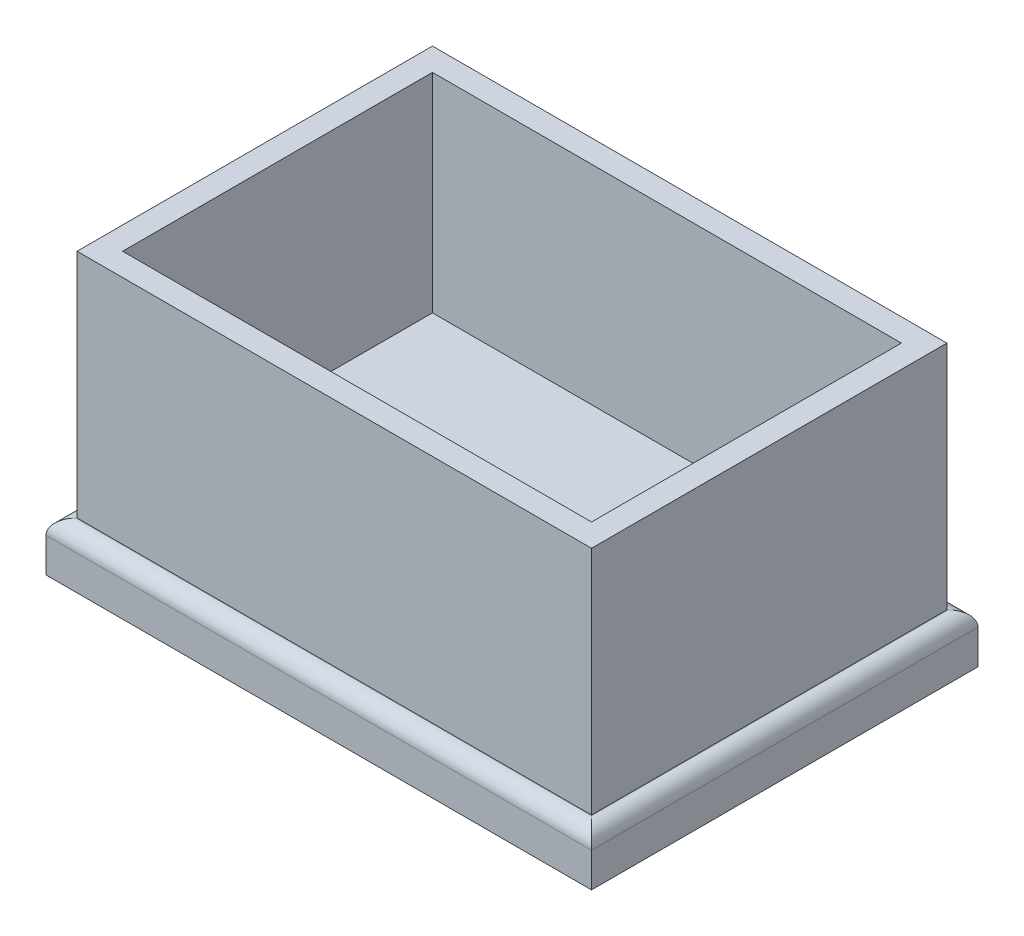
ISO-10303-21;
HEADER;
FILE_DESCRIPTION(('STEP AP214'),'2;1');
FILE_NAME('part.step','',(''),(''),'','','');
FILE_SCHEMA(('AUTOMOTIVE_DESIGN { 1 0 10303 214 1 1 1 1 }'));
ENDSEC;
DATA;
#1=APPLICATION_CONTEXT('core data for automotive mechanical design processes');
#2=APPLICATION_PROTOCOL_DEFINITION('international standard','automotive_design',2000,#1);
#3=PRODUCT_CONTEXT('',#1,'mechanical');
#4=PRODUCT('Part','Part','',(#3));
#5=PRODUCT_RELATED_PRODUCT_CATEGORY('part','',(#4));
#6=PRODUCT_DEFINITION_FORMATION('','',#4);
#7=PRODUCT_DEFINITION_CONTEXT('part definition',#1,'design');
#8=PRODUCT_DEFINITION('design','',#6,#7);
#9=PRODUCT_DEFINITION_SHAPE('','',#8);
#10=(LENGTH_UNIT() NAMED_UNIT(*) SI_UNIT(.MILLI.,.METRE.));
#11=(NAMED_UNIT(*) PLANE_ANGLE_UNIT() SI_UNIT($,.RADIAN.));
#12=(NAMED_UNIT(*) SI_UNIT($,.STERADIAN.) SOLID_ANGLE_UNIT());
#13=UNCERTAINTY_MEASURE_WITH_UNIT(LENGTH_MEASURE(1.E-05),#10,'distance_accuracy_value','');
#14=(GEOMETRIC_REPRESENTATION_CONTEXT(3) GLOBAL_UNCERTAINTY_ASSIGNED_CONTEXT((#13)) GLOBAL_UNIT_ASSIGNED_CONTEXT((#10,
#11,#12)) REPRESENTATION_CONTEXT('',''));
#15=CARTESIAN_POINT('',(0.,0.,0.));
#16=DIRECTION('',(0.,0.,1.));
#17=DIRECTION('',(1.,0.,0.));
#18=AXIS2_PLACEMENT_3D('',#15,#16,#17);
#19=CARTESIAN_POINT('',(0.,70.8406,0.));
#20=DIRECTION('',(0.,1.,0.));
#21=DIRECTION('',(0.,0.,1.));
#22=AXIS2_PLACEMENT_3D('',#19,#20,#21);
#23=PLANE('',#22);
#24=DIRECTION('',(1.,0.,0.));
#25=VECTOR('',#24,1.);
#26=CARTESIAN_POINT('',(-78.867,70.8406,47.498));
#27=LINE('',#26,#25);
#28=CARTESIAN_POINT('',(-71.882,70.8406,47.498));
#29=VERTEX_POINT('',#28);
#30=CARTESIAN_POINT('',(71.882,70.8406,47.498));
#31=VERTEX_POINT('',#30);
#32=EDGE_CURVE('E191',#29,#31,#27,.T.);
#33=ORIENTED_EDGE('',*,*,#32,.F.);
#34=DIRECTION('',(0.,0.,1.));
#35=VECTOR('',#34,1.);
#36=CARTESIAN_POINT('',(-71.882,70.8406,54.483));
#37=LINE('',#36,#35);
#38=CARTESIAN_POINT('',(-71.882,70.8406,-47.498));
#39=VERTEX_POINT('',#38);
#40=EDGE_CURVE('E189',#39,#29,#37,.T.);
#41=ORIENTED_EDGE('',*,*,#40,.F.);
#42=DIRECTION('',(-1.,0.,0.));
#43=VECTOR('',#42,1.);
#44=CARTESIAN_POINT('',(-78.867,70.8406,-47.498));
#45=LINE('',#44,#43);
#46=CARTESIAN_POINT('',(71.882,70.8406,-47.498));
#47=VERTEX_POINT('',#46);
#48=EDGE_CURVE('E56',#47,#39,#45,.T.);
#49=ORIENTED_EDGE('',*,*,#48,.F.);
#50=DIRECTION('',(0.,0.,-1.));
#51=VECTOR('',#50,1.);
#52=CARTESIAN_POINT('',(71.882,70.8406,54.483));
#53=LINE('',#52,#51);
#54=EDGE_CURVE('E176',#31,#47,#53,.T.);
#55=ORIENTED_EDGE('',*,*,#54,.F.);
#56=EDGE_LOOP('',(#33,#41,#49,#55));
#57=FACE_BOUND('',#56,.T.);
#58=DIRECTION('',(1.,0.,0.));
#59=VECTOR('',#58,1.);
#60=CARTESIAN_POINT('',(-78.867,70.8406,54.483));
#61=LINE('',#60,#59);
#62=CARTESIAN_POINT('',(-78.867,70.8406,54.483));
#63=VERTEX_POINT('',#62);
#64=CARTESIAN_POINT('',(78.867,70.8406,54.483));
#65=VERTEX_POINT('',#64);
#66=EDGE_CURVE('E213',#63,#65,#61,.T.);
#67=ORIENTED_EDGE('',*,*,#66,.T.);
#68=DIRECTION('',(0.,0.,-1.));
#69=VECTOR('',#68,1.);
#70=CARTESIAN_POINT('',(78.867,70.8406,54.483));
#71=LINE('',#70,#69);
#72=CARTESIAN_POINT('',(78.867,70.8406,-54.483));
#73=VERTEX_POINT('',#72);
#74=EDGE_CURVE('E287',#65,#73,#71,.T.);
#75=ORIENTED_EDGE('',*,*,#74,.T.);
#76=DIRECTION('',(-1.,0.,0.));
#77=VECTOR('',#76,1.);
#78=CARTESIAN_POINT('',(-78.867,70.8406,-54.483));
#79=LINE('',#78,#77);
#80=CARTESIAN_POINT('',(-78.867,70.8406,-54.483));
#81=VERTEX_POINT('',#80);
#82=EDGE_CURVE('E285',#73,#81,#79,.T.);
#83=ORIENTED_EDGE('',*,*,#82,.T.);
#84=DIRECTION('',(0.,0.,1.));
#85=VECTOR('',#84,1.);
#86=CARTESIAN_POINT('',(-78.867,70.8406,54.483));
#87=LINE('',#86,#85);
#88=EDGE_CURVE('E280',#81,#63,#87,.T.);
#89=ORIENTED_EDGE('',*,*,#88,.T.);
#90=EDGE_LOOP('',(#67,#75,#83,#89));
#91=FACE_BOUND('',#90,.T.);
#92=ADVANCED_FACE('F39',(#57,#91),#23,.T.);
#93=CARTESIAN_POINT('',(78.867,114.1349,54.483));
#94=DIRECTION('',(-1.,0.,0.));
#95=DIRECTION('',(0.,0.,1.));
#96=AXIS2_PLACEMENT_3D('',#93,#94,#95);
#97=PLANE('',#96);
#98=ORIENTED_EDGE('',*,*,#74,.F.);
#99=DIRECTION('',(0.,-1.,0.));
#100=VECTOR('',#99,1.);
#101=CARTESIAN_POINT('',(78.867,114.1349,54.483));
#102=LINE('',#101,#100);
#103=CARTESIAN_POINT('',(78.867,0.,54.483));
#104=VERTEX_POINT('',#103);
#105=EDGE_CURVE('E216',#65,#104,#102,.T.);
#106=ORIENTED_EDGE('',*,*,#105,.T.);
#107=DIRECTION('',(0.,0.,-1.));
#108=VECTOR('',#107,1.);
#109=CARTESIAN_POINT('',(78.867,0.,54.483));
#110=LINE('',#109,#108);
#111=CARTESIAN_POINT('',(78.8669999999999,0.,-54.483));
#112=VERTEX_POINT('',#111);
#113=EDGE_CURVE('E233',#104,#112,#110,.T.);
#114=ORIENTED_EDGE('',*,*,#113,.T.);
#115=DIRECTION('',(0.,-1.,0.));
#116=VECTOR('',#115,1.);
#117=CARTESIAN_POINT('',(78.867,114.1349,-54.483));
#118=LINE('',#117,#116);
#119=EDGE_CURVE('E292',#73,#112,#118,.T.);
#120=ORIENTED_EDGE('',*,*,#119,.F.);
#121=EDGE_LOOP('',(#98,#106,#114,#120));
#122=FACE_BOUND('',#121,.T.);
#123=ADVANCED_FACE('F261',(#122),#97,.F.);
#124=CARTESIAN_POINT('',(-78.867,114.1349,-54.483));
#125=DIRECTION('',(0.,0.,1.));
#126=DIRECTION('',(1.,0.,0.));
#127=AXIS2_PLACEMENT_3D('',#124,#125,#126);
#128=PLANE('',#127);
#129=ORIENTED_EDGE('',*,*,#82,.F.);
#130=ORIENTED_EDGE('',*,*,#119,.T.);
#131=DIRECTION('',(-1.,0.,0.));
#132=VECTOR('',#131,1.);
#133=CARTESIAN_POINT('',(-78.867,0.,-54.483));
#134=LINE('',#133,#132);
#135=CARTESIAN_POINT('',(-78.867,0.,-54.483));
#136=VERTEX_POINT('',#135);
#137=EDGE_CURVE('E229',#112,#136,#134,.T.);
#138=ORIENTED_EDGE('',*,*,#137,.T.);
#139=DIRECTION('',(0.,-1.,0.));
#140=VECTOR('',#139,1.);
#141=CARTESIAN_POINT('',(-78.867,114.1349,-54.483));
#142=LINE('',#141,#140);
#143=EDGE_CURVE('E217',#81,#136,#142,.T.);
#144=ORIENTED_EDGE('',*,*,#143,.F.);
#145=EDGE_LOOP('',(#129,#130,#138,#144));
#146=FACE_BOUND('',#145,.T.);
#147=ADVANCED_FACE('F264',(#146),#128,.F.);
#148=CARTESIAN_POINT('',(-78.867,114.1349,54.483));
#149=DIRECTION('',(1.,0.,0.));
#150=DIRECTION('',(0.,0.,-1.));
#151=AXIS2_PLACEMENT_3D('',#148,#149,#150);
#152=PLANE('',#151);
#153=ORIENTED_EDGE('',*,*,#88,.F.);
#154=ORIENTED_EDGE('',*,*,#143,.T.);
#155=DIRECTION('',(0.,0.,1.));
#156=VECTOR('',#155,1.);
#157=CARTESIAN_POINT('',(-78.867,0.,54.483));
#158=LINE('',#157,#156);
#159=CARTESIAN_POINT('',(-78.867,0.,54.483));
#160=VERTEX_POINT('',#159);
#161=EDGE_CURVE('E224',#136,#160,#158,.T.);
#162=ORIENTED_EDGE('',*,*,#161,.T.);
#163=DIRECTION('',(0.,-1.,0.));
#164=VECTOR('',#163,1.);
#165=CARTESIAN_POINT('',(-78.867,114.1349,54.483));
#166=LINE('',#165,#164);
#167=EDGE_CURVE('E214',#63,#160,#166,.T.);
#168=ORIENTED_EDGE('',*,*,#167,.F.);
#169=EDGE_LOOP('',(#153,#154,#162,#168));
#170=FACE_BOUND('',#169,.T.);
#171=ADVANCED_FACE('F267',(#170),#152,.F.);
#172=CARTESIAN_POINT('',(-78.867,114.1349,54.483));
#173=DIRECTION('',(0.,0.,-1.));
#174=DIRECTION('',(-1.,0.,0.));
#175=AXIS2_PLACEMENT_3D('',#172,#173,#174);
#176=PLANE('',#175);
#177=ORIENTED_EDGE('',*,*,#66,.F.);
#178=ORIENTED_EDGE('',*,*,#167,.T.);
#179=DIRECTION('',(1.,0.,0.));
#180=VECTOR('',#179,1.);
#181=CARTESIAN_POINT('',(-78.867,0.,54.483));
#182=LINE('',#181,#180);
#183=EDGE_CURVE('E220',#160,#104,#182,.T.);
#184=ORIENTED_EDGE('',*,*,#183,.T.);
#185=ORIENTED_EDGE('',*,*,#105,.F.);
#186=EDGE_LOOP('',(#177,#178,#184,#185));
#187=FACE_BOUND('',#186,.T.);
#188=ADVANCED_FACE('F41',(#187),#176,.F.);
#189=CARTESIAN_POINT('',(24.384,-15.113,0.));
#190=DIRECTION('',(0.,1.,0.));
#191=DIRECTION('',(0.,0.,1.));
#192=AXIS2_PLACEMENT_3D('',#189,#190,#191);
#193=PLANE('',#192);
#194=CARTESIAN_POINT('',(-73.7235000000001,-15.113,49.3395));
#195=DIRECTION('',(-0.707106781186547,0.,0.707106781186547));
#196=VECTOR('',#195,1.);
#197=LINE('',#194,#196);
#198=CARTESIAN_POINT('',(-73.7235,-15.113,49.3395));
#199=VERTEX_POINT('',#198);
#200=CARTESIAN_POINT('',(-83.6295,-15.113,59.2455));
#201=VERTEX_POINT('',#200);
#202=EDGE_CURVE('E391',#199,#201,#197,.T.);
#203=ORIENTED_EDGE('',*,*,#202,.F.);
#204=DIRECTION('',(-1.,0.,0.));
#205=VECTOR('',#204,1.);
#206=CARTESIAN_POINT('',(73.7234999999999,-15.113,49.3395));
#207=LINE('',#206,#205);
#208=CARTESIAN_POINT('',(73.7234999999999,-15.113,49.3395));
#209=VERTEX_POINT('',#208);
#210=EDGE_CURVE('E425',#209,#199,#207,.T.);
#211=ORIENTED_EDGE('',*,*,#210,.F.);
#212=DIRECTION('',(-0.707106781186548,0.,-0.707106781186548));
#213=VECTOR('',#212,1.);
#214=CARTESIAN_POINT('',(24.384,-15.113,0.));
#215=LINE('',#214,#213);
#216=CARTESIAN_POINT('',(83.6295,-15.113,59.2455));
#217=VERTEX_POINT('',#216);
#218=EDGE_CURVE('E435',#217,#209,#215,.T.);
#219=ORIENTED_EDGE('',*,*,#218,.F.);
#220=DIRECTION('',(-1.,0.,0.));
#221=VECTOR('',#220,1.);
#222=CARTESIAN_POINT('',(83.6295,-15.113,59.2455));
#223=LINE('',#222,#221);
#224=EDGE_CURVE('E517',#217,#201,#223,.T.);
#225=ORIENTED_EDGE('',*,*,#224,.T.);
#226=EDGE_LOOP('',(#203,#211,#219,#225));
#227=FACE_BOUND('',#226,.T.);
#228=ADVANCED_FACE('F276',(#227),#193,.F.);
#229=CARTESIAN_POINT('',(73.7235,-15.1129999999998,49.3395));
#230=DIRECTION('',(0.,0.,1.));
#231=DIRECTION('',(0.,-1.,0.));
#232=AXIS2_PLACEMENT_3D('',#229,#230,#231);
#233=PLANE('',#232);
#234=CARTESIAN_POINT('',(-73.7235,0.,49.3395));
#235=DIRECTION('',(0.,-1.,0.));
#236=VECTOR('',#235,1.);
#237=LINE('',#234,#236);
#238=CARTESIAN_POINT('',(-73.7235,0.,49.3395));
#239=VERTEX_POINT('',#238);
#240=EDGE_CURVE('E328',#239,#199,#237,.T.);
#241=ORIENTED_EDGE('',*,*,#240,.F.);
#242=DIRECTION('',(-1.,0.,0.));
#243=VECTOR('',#242,1.);
#244=CARTESIAN_POINT('',(73.7235,0.,49.3395));
#245=LINE('',#244,#243);
#246=CARTESIAN_POINT('',(73.7235,0.,49.3395));
#247=VERTEX_POINT('',#246);
#248=EDGE_CURVE('E64',#247,#239,#245,.T.);
#249=ORIENTED_EDGE('',*,*,#248,.F.);
#250=DIRECTION('',(0.,1.,0.));
#251=VECTOR('',#250,1.);
#252=CARTESIAN_POINT('',(73.7235,-15.1129999999998,49.3395));
#253=LINE('',#252,#251);
#254=EDGE_CURVE('E314',#209,#247,#253,.T.);
#255=ORIENTED_EDGE('',*,*,#254,.F.);
#256=ORIENTED_EDGE('',*,*,#210,.T.);
#257=EDGE_LOOP('',(#241,#249,#255,#256));
#258=FACE_BOUND('',#257,.T.);
#259=ADVANCED_FACE('F401',(#258),#233,.F.);
#260=CARTESIAN_POINT('',(24.384,0.,0.));
#261=DIRECTION('',(0.,-1.,0.));
#262=DIRECTION('',(0.,0.,-1.));
#263=AXIS2_PLACEMENT_3D('',#260,#261,#262);
#264=PLANE('',#263);
#265=CARTESIAN_POINT('',(-79.0575,0.,54.6735));
#266=DIRECTION('',(0.707106781186573,0.,-0.707106781186522));
#267=VECTOR('',#266,1.);
#268=LINE('',#265,#267);
#269=CARTESIAN_POINT('',(-79.0575,0.,54.6735));
#270=VERTEX_POINT('',#269);
#271=EDGE_CURVE('E320',#270,#160,#268,.T.);
#272=ORIENTED_EDGE('',*,*,#271,.F.);
#273=DIRECTION('',(-1.,0.,0.));
#274=VECTOR('',#273,1.);
#275=CARTESIAN_POINT('',(79.0574999999999,0.,54.6734999999999));
#276=LINE('',#275,#274);
#277=CARTESIAN_POINT('',(79.0574999999999,0.,54.6734999999999));
#278=VERTEX_POINT('',#277);
#279=EDGE_CURVE('E312',#278,#270,#276,.T.);
#280=ORIENTED_EDGE('',*,*,#279,.F.);
#281=DIRECTION('',(0.707106781186548,0.,0.707106781186548));
#282=VECTOR('',#281,1.);
#283=CARTESIAN_POINT('',(24.384,0.,0.));
#284=LINE('',#283,#282);
#285=EDGE_CURVE('E303',#104,#278,#284,.T.);
#286=ORIENTED_EDGE('',*,*,#285,.F.);
#287=ORIENTED_EDGE('',*,*,#183,.F.);
#288=EDGE_LOOP('',(#272,#280,#286,#287));
#289=FACE_BOUND('',#288,.T.);
#290=ADVANCED_FACE('F310',(#289),#264,.F.);
#291=CARTESIAN_POINT('',(79.0574999999999,-4.572,54.6735));
#292=DIRECTION('',(-1.,0.,0.));
#293=DIRECTION('',(0.,0.,1.));
#294=AXIS2_PLACEMENT_3D('',#291,#292,#293);
#295=CYLINDRICAL_SURFACE('',#294,4.572);
#296=CARTESIAN_POINT('',(-83.6295,-4.57200000000003,59.2455));
#297=CARTESIAN_POINT('',(-83.6295003122453,-4.5387716705684,59.2455002509367));
#298=CARTESIAN_POINT('',(-83.6291377682137,-4.50554334712946,59.2451374175496));
#299=CARTESIAN_POINT('',(-83.6276885649766,-4.43908942066017,59.2436875900981));
#300=CARTESIAN_POINT('',(-83.6266012775349,-4.40586384502427,59.2425999677581));
#301=CARTESIAN_POINT('',(-83.6237022488835,-4.33943139852653,59.2397006357276));
#302=CARTESIAN_POINT('',(-83.6218895380748,-4.30622461250595,59.2378879569299));
#303=CARTESIAN_POINT('',(-83.6175400351869,-4.23984481811414,59.2335388385127));
#304=CARTESIAN_POINT('',(-83.6150019380096,-4.20667197976568,59.2310010943751));
#305=CARTESIAN_POINT('',(-83.6106549557606,-4.15698061894298,59.2266546626324));
#306=CARTESIAN_POINT('',(-83.6091144734599,-4.14041431605409,59.2251143674901));
#307=CARTESIAN_POINT('',(-83.6058579739381,-4.10735052633055,59.2218580796928));
#308=CARTESIAN_POINT('',(-83.6041423191785,-4.09085296806931,59.2201424498283));
#309=CARTESIAN_POINT('',(-83.5987199879488,-4.04133070125161,59.2147199911055));
#310=CARTESIAN_POINT('',(-83.5947456006521,-4.00836385224596,59.2107452480425));
#311=CARTESIAN_POINT('',(-83.5860765070315,-3.94248673157719,59.2020755806639));
#312=CARTESIAN_POINT('',(-83.58137903159,-3.90957719127139,59.1973778877776));
#313=CARTESIAN_POINT('',(-83.5712637516267,-3.84382978999245,59.1872624977335));
#314=CARTESIAN_POINT('',(-83.5658428944752,-3.81099286782059,59.181841749367));
#315=CARTESIAN_POINT('',(-83.5542812532178,-3.74540670701605,59.1702806584444));
#316=CARTESIAN_POINT('',(-83.5481371496976,-3.7126586389972,59.1641369980631));
#317=CARTESIAN_POINT('',(-83.5351719138021,-3.64747798523572,59.1511720652389));
#318=CARTESIAN_POINT('',(-83.5283516747887,-3.61504504376672,59.1443516869175));
#319=CARTESIAN_POINT('',(-83.5139968013825,-3.55027225592321,59.1299963105066));
#320=CARTESIAN_POINT('',(-83.5064579314104,-3.51793428777215,59.1224570754276));
#321=CARTESIAN_POINT('',(-83.4906656255431,-3.45336758127208,59.1066643612438));
#322=CARTESIAN_POINT('',(-83.4824077549983,-3.42114101359398,59.0984064496548));
#323=CARTESIAN_POINT('',(-83.465177403182,-3.35681260535168,59.0811763418689));
#324=CARTESIAN_POINT('',(-83.4562003072798,-3.32471323334729,59.0721995333355));
#325=CARTESIAN_POINT('',(-83.4422253667446,-3.2767599708803,59.0582250917592));
#326=CARTESIAN_POINT('',(-83.4374684898527,-3.26076481320882,59.0534683930843));
#327=CARTESIAN_POINT('',(-83.427824518012,-3.22897289989649,59.0438246141686));
#328=CARTESIAN_POINT('',(-83.4229384362925,-3.21317552924479,59.0389385481834));
#329=CARTESIAN_POINT('',(-83.4079823902339,-3.16573140116124,59.0239823388439));
#330=CARTESIAN_POINT('',(-83.3976735253158,-3.13423459702778,59.0136730815587));
#331=CARTESIAN_POINT('',(-83.3763485138636,-3.0713860181909,58.9923474563481));
#332=CARTESIAN_POINT('',(-83.365326984161,-3.04003790250865,58.9813257067744));
#333=CARTESIAN_POINT('',(-83.3425763230593,-2.97750262371743,58.9585749634491));
#334=CARTESIAN_POINT('',(-83.3308417226758,-2.94631943886358,58.9468405039438));
#335=CARTESIAN_POINT('',(-83.306665174038,-2.88413075922896,58.9226645644101));
#336=CARTESIAN_POINT('',(-83.2942176928045,-2.85312956704664,58.9102175544146));
#337=CARTESIAN_POINT('',(-83.2687888941333,-2.79173900851275,58.8847890319568));
#338=CARTESIAN_POINT('',(-83.2558099699615,-2.76134765745318,58.8718099154793));
#339=CARTESIAN_POINT('',(-83.2291528174252,-2.70074264014692,58.8451521763751));
#340=CARTESIAN_POINT('',(-83.2154686903088,-2.67053416540363,58.8314676529033));
#341=CARTESIAN_POINT('',(-83.187400728842,-2.61031212094427,58.8033992732543));
#342=CARTESIAN_POINT('',(-83.1730109955722,-2.58030405149153,58.7890095221907));
#343=CARTESIAN_POINT('',(-83.1435315594735,-2.52049970720002,58.7595304066459));
#344=CARTESIAN_POINT('',(-83.1284359712746,-2.49070922898993,58.7444351606469));
#345=CARTESIAN_POINT('',(-83.1053317492233,-2.44631811961757,58.7213314770304));
#346=CARTESIAN_POINT('',(-83.0975209260305,-2.43151077246711,58.7135208383046));
#347=CARTESIAN_POINT('',(-83.0818625000404,-2.40221591853126,58.6978625867039));
#348=CARTESIAN_POINT('',(-83.0740164879899,-2.38772670998566,58.6900165669047));
#349=CARTESIAN_POINT('',(-83.0501471056995,-2.34420860663887,58.6661469413077));
#350=CARTESIAN_POINT('',(-83.0339294090764,-2.31539231703254,58.6499287852687));
#351=CARTESIAN_POINT('',(-83.0008024619903,-2.25798592563259,58.61680114872));
#352=CARTESIAN_POINT('',(-82.9838872345218,-2.22940272941223,58.5998856940342));
#353=CARTESIAN_POINT('',(-82.9493646853182,-2.17248032995581,58.5653631147207));
#354=CARTESIAN_POINT('',(-82.931751459115,-2.14414828607397,58.5477500908027));
#355=CARTESIAN_POINT('',(-82.8958330780982,-2.08774667428282,58.5118324343895));
#356=CARTESIAN_POINT('',(-82.8775221060302,-2.05968451562842,58.4935219885111));
#357=CARTESIAN_POINT('',(-82.8406137341418,-2.00444722840746,58.4566138505346));
#358=CARTESIAN_POINT('',(-82.8220207609785,-1.97726617635054,58.438020592889));
#359=CARTESIAN_POINT('',(-82.7841502826974,-1.9231575074998,58.4001493795082));
#360=CARTESIAN_POINT('',(-82.7648669716743,-1.89623802113158,58.3808656157165));
#361=CARTESIAN_POINT('',(-82.7256152251929,-1.84267191902314,58.3416134308475));
#362=CARTESIAN_POINT('',(-82.7056410970714,-1.81603364595126,58.3216393233769));
#363=CARTESIAN_POINT('',(-82.6650073801998,-1.76304934058118,58.2810060593388));
#364=CARTESIAN_POINT('',(-82.6443422169288,-1.73671184997557,58.2603413336964));
#365=CARTESIAN_POINT('',(-82.6129348883916,-1.69756957050213,58.2289346168101));
#366=CARTESIAN_POINT('',(-82.6023447614151,-1.68451996248559,58.2183446871038));
#367=CARTESIAN_POINT('',(-82.5812784081656,-1.65885053702225,58.1972784809712));
#368=CARTESIAN_POINT('',(-82.5708042211093,-1.64622736844127,58.1868042486934));
#369=CARTESIAN_POINT('',(-82.5390124951373,-1.60832827828627,58.1550121479984));
#370=CARTESIAN_POINT('',(-82.517547630774,-1.5832990454523,58.1335467109336));
#371=CARTESIAN_POINT('',(-82.473937377409,-1.53353825945182,58.0899356372672));
#372=CARTESIAN_POINT('',(-82.4517866466247,-1.50881607572084,58.0677846636471));
#373=CARTESIAN_POINT('',(-82.4068040368958,-1.45969034772306,58.0228021051552));
#374=CARTESIAN_POINT('',(-82.3839669511484,-1.43529633234018,57.999965321164));
#375=CARTESIAN_POINT('',(-82.337611836938,-1.3868484859693,57.9536111272553));
#376=CARTESIAN_POINT('',(-82.3140887460394,-1.36280434085654,57.9300886593209));
#377=CARTESIAN_POINT('',(-82.267131986618,-1.31584757749779,57.8831320717397));
#378=CARTESIAN_POINT('',(-82.2437046468306,-1.29292227632924,57.8597043003943));
#379=CARTESIAN_POINT('',(-82.1961689103932,-1.24738854734355,57.8121675834727));
#380=CARTESIAN_POINT('',(-82.1720555809452,-1.22479042233594,57.7880537033946));
#381=CARTESIAN_POINT('',(-82.1231471207202,-1.17993433335198,57.7391447623611));
#382=CARTESIAN_POINT('',(-82.0983472001529,-1.15768680892296,57.7143449212032));
#383=CARTESIAN_POINT('',(-82.0480652648412,-1.11355538010271,57.6640636514085));
#384=CARTESIAN_POINT('',(-82.0225786054934,-1.09168204504101,57.6385775858042));
#385=CARTESIAN_POINT('',(-81.9839819586315,-1.05928399782117,57.5999816800868));
#386=CARTESIAN_POINT('',(-81.9709825221533,-1.04849492631134,57.5869824665536));
#387=CARTESIAN_POINT('',(-81.9453285706857,-1.02744127249224,57.5613286244987));
#388=CARTESIAN_POINT('',(-81.9326763947488,-1.01717097684623,57.5486763456113));
#389=CARTESIAN_POINT('',(-81.8943017543855,-0.986358471034573,57.5103011188433));
#390=CARTESIAN_POINT('',(-81.8684743438202,-0.966077281102163,57.4844729429777));
#391=CARTESIAN_POINT('',(-81.816128303867,-0.92587041359739,57.4321258536925));
#392=CARTESIAN_POINT('',(-81.789605301145,-0.905956125210953,57.4056025750888));
#393=CARTESIAN_POINT('',(-81.7358674315524,-0.866509360256588,57.3518648789018));
#394=CARTESIAN_POINT('',(-81.7086483336955,-0.846988395280442,57.3246462422238));
#395=CARTESIAN_POINT('',(-81.6535186323941,-0.808355175254443,57.2695177953344));
#396=CARTESIAN_POINT('',(-81.6256039502815,-0.789254555467157,57.2416039116801));
#397=CARTESIAN_POINT('',(-81.5704339517752,-0.752391136943889,57.1864339891324));
#398=CARTESIAN_POINT('',(-81.5431863836346,-0.734605061199112,57.1591857466864));
#399=CARTESIAN_POINT('',(-81.487974901593,-0.699395291065961,57.1039728593291));
#400=CARTESIAN_POINT('',(-81.4600069900591,-0.681984135953523,57.0760042159745));
#401=CARTESIAN_POINT('',(-81.4033538664873,-0.647554556662577,57.0193505168411));
#402=CARTESIAN_POINT('',(-81.374664795622,-0.63054881100853,56.9906616184287));
#403=CARTESIAN_POINT('',(-81.3165691684178,-0.596960864846072,56.9325670142107));
#404=CARTESIAN_POINT('',(-81.287158898361,-0.580391481160765,56.9031576066301));
#405=CARTESIAN_POINT('',(-81.242699458989,-0.555984796599487,56.8586991532293));
#406=CARTESIAN_POINT('',(-81.2277251959744,-0.547873280429795,56.8437251683517));
#407=CARTESIAN_POINT('',(-81.1985000398673,-0.532252108999196,56.8145000660656));
#408=CARTESIAN_POINT('',(-81.1842516639045,-0.524732987431809,56.8002514909573));
#409=CARTESIAN_POINT('',(-81.1409940251444,-0.502195950132338,56.7569928903155));
#410=CARTESIAN_POINT('',(-81.1119160403074,-0.487441656705464,56.7279137733191));
#411=CARTESIAN_POINT('',(-81.0529893339878,-0.458326649372881,56.6689855671789));
#412=CARTESIAN_POINT('',(-81.0231370647157,-0.443980280521177,56.6391329464553));
#413=CARTESIAN_POINT('',(-80.9626610946761,-0.415717814417411,56.5786573456253));
#414=CARTESIAN_POINT('',(-80.9320339867804,-0.401816250611412,56.548030980178));
#415=CARTESIAN_POINT('',(-80.8700089721649,-0.374480918836409,56.4860078660381));
#416=CARTESIAN_POINT('',(-80.8386078166258,-0.361061876881425,56.4546078764687));
#417=CARTESIAN_POINT('',(-80.7774486273206,-0.335728905528298,56.3934485708979));
#418=CARTESIAN_POINT('',(-80.747699255607,-0.323772787277471,56.3636980530631));
#419=CARTESIAN_POINT('',(-80.6873217633536,-0.300239121308314,56.3033182765273));
#420=CARTESIAN_POINT('',(-80.6566903236004,-0.28867860018904,56.272685699534));
#421=CARTESIAN_POINT('',(-80.5945472605786,-0.26598205057589,56.2105418120646));
#422=CARTESIAN_POINT('',(-80.5630324555404,-0.254863355294257,56.1790273560181));
#423=CARTESIAN_POINT('',(-80.4991226479187,-0.233097513987336,56.115119287362));
#424=CARTESIAN_POINT('',(-80.4667246246177,-0.22246801219434,56.0827226787384));
#425=CARTESIAN_POINT('',(-80.4177537516345,-0.207003595548335,56.0337533611926));
#426=CARTESIAN_POINT('',(-80.4012249650369,-0.201887176893408,56.01722499977));
#427=CARTESIAN_POINT('',(-80.3696880070198,-0.192320545119936,55.9856879755407));
#428=CARTESIAN_POINT('',(-80.3546824491585,-0.187852824952017,55.9706820084293));
#429=CARTESIAN_POINT('',(-80.3088677612039,-0.174467488686663,55.9248654737832));
#430=CARTESIAN_POINT('',(-80.2780211701375,-0.165807119139564,55.8940168167373));
#431=CARTESIAN_POINT('',(-80.2152160656333,-0.148882332013871,55.8312089864158));
#432=CARTESIAN_POINT('',(-80.1832544948263,-0.140640458151927,55.7992468044969));
#433=CARTESIAN_POINT('',(-80.1182184075596,-0.124616761514803,55.7342115835163));
#434=CARTESIAN_POINT('',(-80.085141003688,-0.116858098147639,55.7011357244966));
#435=CARTESIAN_POINT('',(-80.017874799944,-0.101867100984803,55.6338727530263));
#436=CARTESIAN_POINT('',(-79.9836833460498,-0.0946585522046184,55.5996829894893));
#437=CARTESIAN_POINT('',(-79.9176711931475,-0.0815279079061144,55.5336715242017));
#438=CARTESIAN_POINT('',(-79.885855865928,-0.0755506742171613,55.501855378238));
#439=CARTESIAN_POINT('',(-79.8121733999889,-0.0625147693885983,55.4281725695602));
#440=CARTESIAN_POINT('',(-79.7702837934092,-0.0557050335286398,55.386283925704));
#441=CARTESIAN_POINT('',(-79.7047679497851,-0.0459866715793628,55.3207678753787));
#442=CARTESIAN_POINT('',(-79.6811707399287,-0.0426748835288452,55.2971702447337));
#443=CARTESIAN_POINT('',(-79.6243336215214,-0.035150097451877,55.2403326095853));
#444=CARTESIAN_POINT('',(-79.5910813659736,-0.031119534798868,55.2070804602322));
#445=CARTESIAN_POINT('',(-79.5404227308879,-0.025542524235768,55.1564224824178));
#446=CARTESIAN_POINT('',(-79.5230309192719,-0.0237288408042478,55.1390309852599));
#447=CARTESIAN_POINT('',(-79.4905176457067,-0.0205265625574871,55.1065175883665));
#448=CARTESIAN_POINT('',(-79.4753973452204,-0.0191134083088769,55.0913969432755));
#449=CARTESIAN_POINT('',(-79.4275497464314,-0.0148817844617613,55.0435483908914));
#450=CARTESIAN_POINT('',(-79.3948097961921,-0.0123417183913631,55.0108079906811));
#451=CARTESIAN_POINT('',(-79.3353247453451,-0.00837039234452502,54.9513239186669));
#452=CARTESIAN_POINT('',(-79.3085836753878,-0.00682114782787168,54.9245839474387));
#453=CARTESIAN_POINT('',(-79.2464704854522,-0.00376969068435433,54.862470125716));
#454=CARTESIAN_POINT('',(-79.2110944744156,-0.00244358069529252,54.8270913581203));
#455=CARTESIAN_POINT('',(-79.1363143162057,-0.000509531686807293,54.7523080092873));
#456=CARTESIAN_POINT('',(-79.0969087320189,-1.96964722090599E-07,54.7129022901749));
#457=CARTESIAN_POINT('',(-79.0575,0.,54.6735));
#458=B_SPLINE_CURVE_WITH_KNOTS('',3,(#296,#297,#298,#299,#300,#301,#302,#303,#304,#305,#306,
#307,#308,#309,#310,#311,#312,#313,#314,#315,#316,#317,#318,#319,#320,#321,#322,#323,#324,#325,
#326,#327,#328,#329,#330,#331,#332,#333,#334,#335,#336,#337,#338,#339,#340,#341,#342,#343,#344,
#345,#346,#347,#348,#349,#350,#351,#352,#353,#354,#355,#356,#357,#358,#359,#360,#361,#362,#363,
#364,#365,#366,#367,#368,#369,#370,#371,#372,#373,#374,#375,#376,#377,#378,#379,#380,#381,#382,
#383,#384,#385,#386,#387,#388,#389,#390,#391,#392,#393,#394,#395,#396,#397,#398,#399,#400,#401,
#402,#403,#404,#405,#406,#407,#408,#409,#410,#411,#412,#413,#414,#415,#416,#417,#418,#419,#420,
#421,#422,#423,#424,#425,#426,#427,#428,#429,#430,#431,#432,#433,#434,#435,#436,#437,#438,#439,
#440,#441,#442,#443,#444,#445,#446,#447,#448,#449,#450,#451,#452,#453,#454,#455,#456,#457),
.UNSPECIFIED.,.F.,.F.,(4,2,2,2,2,2,2,2,2,2,2,2,2,2,2,2,2,2,2,2,2,2,2,2,2,2,2,2,2,2,2,2,2,2,2,2,
2,2,2,2,2,2,2,2,2,2,2,2,2,2,2,2,2,2,2,2,2,2,2,2,2,2,2,2,2,2,2,2,2,2,2,2,2,2,2,2,2,2,2,2,4),(0.,
0.0996810533152722,0.199448626679894,0.299349996907926,0.399432251204875,0.449557325329498,
0.499580706937186,0.599891716237376,0.700596896542243,0.8017413429549,0.903369565838415,
1.00486525544312,1.10700126974072,1.20981917854714,1.31335973037325,1.36541483521248,
1.41714088343302,1.52124815620264,1.62626315411938,1.73222190836004,1.8391594961469,
1.94565943110876,2.05327437017155,2.1620351777801,2.27197175328154,2.32739116546445,
2.3821394799124,2.49261605654959,2.60442337341459,2.71758620638931,2.83212845174704,
2.94557299343565,3.06052072597151,3.1769916418578,3.29500495947148,3.35459674909925,
3.41298122023019,3.53100398871928,3.65071382925245,3.77212580282999,3.89525434583125,
4.01611571750753,4.13883669920645,4.26342877232073,4.38990290864815,4.45384982190634,
4.51574191458371,4.64107055069447,4.76846731451151,4.89794027880286,5.02949713409462,
5.15681361250792,5.28645386097937,5.41842358225568,5.55272818228272,5.62075835081302,
5.68528038669964,5.81634354502913,5.95010348645483,6.08656379792009,6.22572785743688,
6.3569382303642,6.49144091171228,6.62923808618739,6.77033178517592,6.84211606048796,
6.90717517007821,7.0405987486857,7.17843166804732,7.32067497485426,7.46732962056344,
7.60349348273373,7.78237074675076,7.88297638158532,8.02456399858852,8.09855018911655,
8.16284042369099,8.30194789301333,8.41549089645361,8.56563021470654,8.73281161419367),.UNSPECIFIED.);
#459=CARTESIAN_POINT('',(-83.6295,-4.57200000000003,59.2455));
#460=VERTEX_POINT('',#459);
#461=EDGE_CURVE('E327',#460,#270,#458,.T.);
#462=ORIENTED_EDGE('',*,*,#461,.F.);
#463=DIRECTION('',(-1.,0.,0.));
#464=VECTOR('',#463,1.);
#465=CARTESIAN_POINT('',(83.6295,-4.57200000000003,59.2455));
#466=LINE('',#465,#464);
#467=CARTESIAN_POINT('',(83.6295,-4.57200000000003,59.2455));
#468=VERTEX_POINT('',#467);
#469=EDGE_CURVE('E518',#468,#460,#466,.T.);
#470=ORIENTED_EDGE('',*,*,#469,.F.);
#471=CARTESIAN_POINT('',(79.0574999999999,-4.572,54.6735));
#472=DIRECTION('',(-0.707106781186548,0.,0.707106781186548));
#473=DIRECTION('',(0.707106781186548,0.,0.707106781186548));
#474=AXIS2_PLACEMENT_3D('',#471,#472,#473);
#475=ELLIPSE('',#474,6.46578440716979,4.572);
#476=EDGE_CURVE('E315',#278,#468,#475,.F.);
#477=ORIENTED_EDGE('',*,*,#476,.F.);
#478=ORIENTED_EDGE('',*,*,#279,.T.);
#479=EDGE_LOOP('',(#462,#470,#477,#478));
#480=FACE_BOUND('',#479,.T.);
#481=ADVANCED_FACE('F542',(#480),#295,.T.);
#482=CARTESIAN_POINT('',(83.6295,-4.57200000000003,59.2455));
#483=DIRECTION('',(0.,0.,-1.));
#484=DIRECTION('',(-1.,0.,0.));
#485=AXIS2_PLACEMENT_3D('',#482,#483,#484);
#486=PLANE('',#485);
#487=CARTESIAN_POINT('',(-83.6295,-15.113,59.2455));
#488=DIRECTION('',(0.,1.,0.));
#489=VECTOR('',#488,1.);
#490=LINE('',#487,#489);
#491=EDGE_CURVE('E237',#201,#460,#490,.T.);
#492=ORIENTED_EDGE('',*,*,#491,.F.);
#493=ORIENTED_EDGE('',*,*,#224,.F.);
#494=DIRECTION('',(0.,-1.,0.));
#495=VECTOR('',#494,1.);
#496=CARTESIAN_POINT('',(83.6295,-4.57200000000003,59.2455));
#497=LINE('',#496,#495);
#498=EDGE_CURVE('E504',#468,#217,#497,.T.);
#499=ORIENTED_EDGE('',*,*,#498,.F.);
#500=ORIENTED_EDGE('',*,*,#469,.T.);
#501=EDGE_LOOP('',(#492,#493,#499,#500));
#502=FACE_BOUND('',#501,.T.);
#503=ADVANCED_FACE('F532',(#502),#486,.F.);
#504=CARTESIAN_POINT('',(73.7235,-15.1129999999999,-49.3395));
#505=DIRECTION('',(-1.,0.,0.));
#506=DIRECTION('',(0.,-1.,0.));
#507=AXIS2_PLACEMENT_3D('',#504,#505,#506);
#508=PLANE('',#507);
#509=DIRECTION('',(0.,0.,1.));
#510=VECTOR('',#509,1.);
#511=CARTESIAN_POINT('',(73.7234999999999,-15.113,-49.3395));
#512=LINE('',#511,#510);
#513=CARTESIAN_POINT('',(73.7234999999999,-15.113,-49.3395));
#514=VERTEX_POINT('',#513);
#515=EDGE_CURVE('E438',#514,#209,#512,.T.);
#516=ORIENTED_EDGE('',*,*,#515,.T.);
#517=ORIENTED_EDGE('',*,*,#254,.T.);
#518=DIRECTION('',(0.,0.,1.));
#519=VECTOR('',#518,1.);
#520=CARTESIAN_POINT('',(73.7235,0.,-49.3395));
#521=LINE('',#520,#519);
#522=CARTESIAN_POINT('',(73.7235,0.,-49.3395));
#523=VERTEX_POINT('',#522);
#524=EDGE_CURVE('E451',#523,#247,#521,.T.);
#525=ORIENTED_EDGE('',*,*,#524,.F.);
#526=DIRECTION('',(0.,-1.,0.));
#527=VECTOR('',#526,1.);
#528=CARTESIAN_POINT('',(73.7235,-15.1129999999999,-49.3395));
#529=LINE('',#528,#527);
#530=EDGE_CURVE('E457',#523,#514,#529,.T.);
#531=ORIENTED_EDGE('',*,*,#530,.T.);
#532=EDGE_LOOP('',(#516,#517,#525,#531));
#533=FACE_BOUND('',#532,.T.);
#534=ADVANCED_FACE('F541',(#533),#508,.T.);
#535=CARTESIAN_POINT('',(0.,0.,24.384));
#536=DIRECTION('',(0.,1.,0.));
#537=DIRECTION('',(-1.,0.,0.));
#538=AXIS2_PLACEMENT_3D('',#535,#536,#537);
#539=PLANE('',#538);
#540=ORIENTED_EDGE('',*,*,#113,.F.);
#541=ORIENTED_EDGE('',*,*,#285,.T.);
#542=DIRECTION('',(0.,0.,1.));
#543=VECTOR('',#542,1.);
#544=CARTESIAN_POINT('',(79.0574999999999,0.,-54.6734999999999));
#545=LINE('',#544,#543);
#546=CARTESIAN_POINT('',(79.0574999999999,0.,-54.6734999999999));
#547=VERTEX_POINT('',#546);
#548=EDGE_CURVE('E447',#547,#278,#545,.T.);
#549=ORIENTED_EDGE('',*,*,#548,.F.);
#550=DIRECTION('',(-0.707106781186548,0.,0.707106781186548));
#551=VECTOR('',#550,1.);
#552=CARTESIAN_POINT('',(0.,0.,24.384));
#553=LINE('',#552,#551);
#554=EDGE_CURVE('E305',#547,#112,#553,.T.);
#555=ORIENTED_EDGE('',*,*,#554,.T.);
#556=EDGE_LOOP('',(#540,#541,#549,#555));
#557=FACE_BOUND('',#556,.T.);
#558=ADVANCED_FACE('F302',(#557),#539,.T.);
#559=CARTESIAN_POINT('',(79.0574999999999,-4.572,-54.6735));
#560=DIRECTION('',(0.,0.,1.));
#561=DIRECTION('',(1.,0.,0.));
#562=AXIS2_PLACEMENT_3D('',#559,#560,#561);
#563=CYLINDRICAL_SURFACE('',#562,4.572);
#564=ORIENTED_EDGE('',*,*,#548,.T.);
#565=ORIENTED_EDGE('',*,*,#476,.T.);
#566=DIRECTION('',(0.,0.,1.));
#567=VECTOR('',#566,1.);
#568=CARTESIAN_POINT('',(83.6295,-4.57200000000003,-59.2455));
#569=LINE('',#568,#567);
#570=CARTESIAN_POINT('',(83.6295,-4.57200000000003,-59.2455));
#571=VERTEX_POINT('',#570);
#572=EDGE_CURVE('E444',#571,#468,#569,.T.);
#573=ORIENTED_EDGE('',*,*,#572,.F.);
#574=CARTESIAN_POINT('',(79.0574999999999,-4.572,-54.6735));
#575=DIRECTION('',(0.707106781186548,0.,0.707106781186548));
#576=DIRECTION('',(0.707106781186548,0.,-0.707106781186548));
#577=AXIS2_PLACEMENT_3D('',#574,#575,#576);
#578=ELLIPSE('',#577,6.46578440716979,4.572);
#579=EDGE_CURVE('E494',#571,#547,#578,.T.);
#580=ORIENTED_EDGE('',*,*,#579,.T.);
#581=EDGE_LOOP('',(#564,#565,#573,#580));
#582=FACE_BOUND('',#581,.T.);
#583=ADVANCED_FACE('F587',(#582),#563,.T.);
#584=CARTESIAN_POINT('',(83.6295,-4.57200000000003,-59.2455));
#585=DIRECTION('',(1.,0.,0.));
#586=DIRECTION('',(0.,0.,-1.));
#587=AXIS2_PLACEMENT_3D('',#584,#585,#586);
#588=PLANE('',#587);
#589=ORIENTED_EDGE('',*,*,#572,.T.);
#590=ORIENTED_EDGE('',*,*,#498,.T.);
#591=DIRECTION('',(0.,0.,1.));
#592=VECTOR('',#591,1.);
#593=CARTESIAN_POINT('',(83.6295,-15.113,-59.2455));
#594=LINE('',#593,#592);
#595=CARTESIAN_POINT('',(83.6295,-15.113,-59.2455));
#596=VERTEX_POINT('',#595);
#597=EDGE_CURVE('E441',#596,#217,#594,.T.);
#598=ORIENTED_EDGE('',*,*,#597,.F.);
#599=DIRECTION('',(0.,1.,0.));
#600=VECTOR('',#599,1.);
#601=CARTESIAN_POINT('',(83.6295,-4.57200000000003,-59.2455));
#602=LINE('',#601,#600);
#603=EDGE_CURVE('E462',#596,#571,#602,.T.);
#604=ORIENTED_EDGE('',*,*,#603,.T.);
#605=EDGE_LOOP('',(#589,#590,#598,#604));
#606=FACE_BOUND('',#605,.T.);
#607=ADVANCED_FACE('F585',(#606),#588,.T.);
#608=CARTESIAN_POINT('',(0.,-15.113,24.384));
#609=DIRECTION('',(0.,-1.,0.));
#610=DIRECTION('',(0.,0.,-1.));
#611=AXIS2_PLACEMENT_3D('',#608,#609,#610);
#612=PLANE('',#611);
#613=ORIENTED_EDGE('',*,*,#597,.T.);
#614=ORIENTED_EDGE('',*,*,#218,.T.);
#615=ORIENTED_EDGE('',*,*,#515,.F.);
#616=DIRECTION('',(0.707106781186548,0.,-0.707106781186548));
#617=VECTOR('',#616,1.);
#618=CARTESIAN_POINT('',(0.,-15.113,24.384));
#619=LINE('',#618,#617);
#620=EDGE_CURVE('E454',#514,#596,#619,.T.);
#621=ORIENTED_EDGE('',*,*,#620,.T.);
#622=EDGE_LOOP('',(#613,#614,#615,#621));
#623=FACE_BOUND('',#622,.T.);
#624=ADVANCED_FACE('F418',(#623),#612,.T.);
#625=CARTESIAN_POINT('',(-73.7235,-15.113,-49.3395));
#626=DIRECTION('',(0.,0.,-1.));
#627=DIRECTION('',(0.,1.,0.));
#628=AXIS2_PLACEMENT_3D('',#625,#626,#627);
#629=PLANE('',#628);
#630=ORIENTED_EDGE('',*,*,#530,.F.);
#631=DIRECTION('',(1.,0.,0.));
#632=VECTOR('',#631,1.);
#633=CARTESIAN_POINT('',(-73.7235,0.,-49.3395));
#634=LINE('',#633,#632);
#635=CARTESIAN_POINT('',(-73.7235,0.,-49.3395));
#636=VERTEX_POINT('',#635);
#637=EDGE_CURVE('E472',#636,#523,#634,.T.);
#638=ORIENTED_EDGE('',*,*,#637,.F.);
#639=DIRECTION('',(0.,1.,0.));
#640=VECTOR('',#639,1.);
#641=CARTESIAN_POINT('',(-73.7235,-15.113,-49.3395));
#642=LINE('',#641,#640);
#643=CARTESIAN_POINT('',(-73.7235,-15.113,-49.3395));
#644=VERTEX_POINT('',#643);
#645=EDGE_CURVE('E476',#644,#636,#642,.T.);
#646=ORIENTED_EDGE('',*,*,#645,.F.);
#647=DIRECTION('',(1.,0.,0.));
#648=VECTOR('',#647,1.);
#649=CARTESIAN_POINT('',(-73.7235,-15.113,-49.3395));
#650=LINE('',#649,#648);
#651=EDGE_CURVE('E458',#644,#514,#650,.T.);
#652=ORIENTED_EDGE('',*,*,#651,.T.);
#653=EDGE_LOOP('',(#630,#638,#646,#652));
#654=FACE_BOUND('',#653,.T.);
#655=ADVANCED_FACE('F579',(#654),#629,.F.);
#656=CARTESIAN_POINT('',(-96.9371855275479,0.,-72.5531855275478));
#657=DIRECTION('',(0.,-1.,0.));
#658=DIRECTION('',(0.,0.,-1.));
#659=AXIS2_PLACEMENT_3D('',#656,#657,#658);
#660=PLANE('',#659);
#661=ORIENTED_EDGE('',*,*,#554,.F.);
#662=DIRECTION('',(1.,0.,0.));
#663=VECTOR('',#662,1.);
#664=CARTESIAN_POINT('',(-79.0575,0.,-54.6734999999999));
#665=LINE('',#664,#663);
#666=CARTESIAN_POINT('',(-79.0575,0.,-54.6734999999999));
#667=VERTEX_POINT('',#666);
#668=EDGE_CURVE('E468',#667,#547,#665,.T.);
#669=ORIENTED_EDGE('',*,*,#668,.F.);
#670=DIRECTION('',(-0.707106781186548,0.,-0.707106781186548));
#671=VECTOR('',#670,1.);
#672=CARTESIAN_POINT('',(-96.9371855275479,0.,-72.5531855275478));
#673=LINE('',#672,#671);
#674=EDGE_CURVE('E479',#136,#667,#673,.T.);
#675=ORIENTED_EDGE('',*,*,#674,.F.);
#676=ORIENTED_EDGE('',*,*,#137,.F.);
#677=EDGE_LOOP('',(#661,#669,#675,#676));
#678=FACE_BOUND('',#677,.T.);
#679=ADVANCED_FACE('F508',(#678),#660,.F.);
#680=CARTESIAN_POINT('',(-79.0575,-4.572,-54.6735));
#681=DIRECTION('',(1.,0.,0.));
#682=DIRECTION('',(0.,0.,-1.));
#683=AXIS2_PLACEMENT_3D('',#680,#681,#682);
#684=CYLINDRICAL_SURFACE('',#683,4.572);
#685=ORIENTED_EDGE('',*,*,#579,.F.);
#686=DIRECTION('',(1.,0.,0.));
#687=VECTOR('',#686,1.);
#688=CARTESIAN_POINT('',(-83.6295,-4.57200000000003,-59.2455));
#689=LINE('',#688,#687);
#690=CARTESIAN_POINT('',(-83.6295,-4.57200000000003,-59.2455));
#691=VERTEX_POINT('',#690);
#692=EDGE_CURVE('E465',#691,#571,#689,.T.);
#693=ORIENTED_EDGE('',*,*,#692,.F.);
#694=CARTESIAN_POINT('',(-79.0575,-4.572,-54.6735));
#695=DIRECTION('',(0.707106781186548,0.,-0.707106781186548));
#696=DIRECTION('',(0.707106781186548,0.,0.707106781186548));
#697=AXIS2_PLACEMENT_3D('',#694,#695,#696);
#698=ELLIPSE('',#697,6.46578440716979,4.572);
#699=EDGE_CURVE('E481',#667,#691,#698,.F.);
#700=ORIENTED_EDGE('',*,*,#699,.F.);
#701=ORIENTED_EDGE('',*,*,#668,.T.);
#702=EDGE_LOOP('',(#685,#693,#700,#701));
#703=FACE_BOUND('',#702,.T.);
#704=ADVANCED_FACE('F512',(#703),#684,.T.);
#705=CARTESIAN_POINT('',(-83.6295,-4.57200000000003,-59.2455));
#706=DIRECTION('',(0.,0.,1.));
#707=DIRECTION('',(1.,0.,0.));
#708=AXIS2_PLACEMENT_3D('',#705,#706,#707);
#709=PLANE('',#708);
#710=ORIENTED_EDGE('',*,*,#603,.F.);
#711=DIRECTION('',(1.,0.,0.));
#712=VECTOR('',#711,1.);
#713=CARTESIAN_POINT('',(-83.6295,-15.113,-59.2455));
#714=LINE('',#713,#712);
#715=CARTESIAN_POINT('',(-83.6295,-15.113,-59.2455));
#716=VERTEX_POINT('',#715);
#717=EDGE_CURVE('E461',#716,#596,#714,.T.);
#718=ORIENTED_EDGE('',*,*,#717,.F.);
#719=DIRECTION('',(0.,-1.,0.));
#720=VECTOR('',#719,1.);
#721=CARTESIAN_POINT('',(-83.6295,-4.57200000000003,-59.2455));
#722=LINE('',#721,#720);
#723=EDGE_CURVE('E484',#691,#716,#722,.T.);
#724=ORIENTED_EDGE('',*,*,#723,.F.);
#725=ORIENTED_EDGE('',*,*,#692,.T.);
#726=EDGE_LOOP('',(#710,#718,#724,#725));
#727=FACE_BOUND('',#726,.T.);
#728=ADVANCED_FACE('F590',(#727),#709,.F.);
#729=CARTESIAN_POINT('',(-99.3184355275479,-15.113,-74.9344355275478));
#730=DIRECTION('',(0.,1.,0.));
#731=DIRECTION('',(0.,0.,1.));
#732=AXIS2_PLACEMENT_3D('',#729,#730,#731);
#733=PLANE('',#732);
#734=ORIENTED_EDGE('',*,*,#620,.F.);
#735=ORIENTED_EDGE('',*,*,#651,.F.);
#736=DIRECTION('',(0.707106781186548,0.,0.707106781186548));
#737=VECTOR('',#736,1.);
#738=CARTESIAN_POINT('',(-99.3184355275479,-15.113,-74.9344355275478));
#739=LINE('',#738,#737);
#740=EDGE_CURVE('E475',#716,#644,#739,.T.);
#741=ORIENTED_EDGE('',*,*,#740,.F.);
#742=ORIENTED_EDGE('',*,*,#717,.T.);
#743=EDGE_LOOP('',(#734,#735,#741,#742));
#744=FACE_BOUND('',#743,.T.);
#745=ADVANCED_FACE('F255',(#744),#733,.F.);
#746=CARTESIAN_POINT('',(-73.7235,-15.113,-90.6233710550957));
#747=DIRECTION('',(1.,0.,0.));
#748=DIRECTION('',(0.,1.,0.));
#749=AXIS2_PLACEMENT_3D('',#746,#747,#748);
#750=PLANE('',#749);
#751=DIRECTION('',(0.,0.,1.));
#752=VECTOR('',#751,1.);
#753=CARTESIAN_POINT('',(-73.7235,-15.113,-90.6233710550957));
#754=LINE('',#753,#752);
#755=EDGE_CURVE('E375',#644,#199,#754,.T.);
#756=ORIENTED_EDGE('',*,*,#755,.F.);
#757=ORIENTED_EDGE('',*,*,#645,.T.);
#758=DIRECTION('',(0.,0.,1.));
#759=VECTOR('',#758,1.);
#760=CARTESIAN_POINT('',(-73.7235,0.,-90.6233710550957));
#761=LINE('',#760,#759);
#762=EDGE_CURVE('E379',#636,#239,#761,.T.);
#763=ORIENTED_EDGE('',*,*,#762,.T.);
#764=ORIENTED_EDGE('',*,*,#240,.T.);
#765=EDGE_LOOP('',(#756,#757,#763,#764));
#766=FACE_BOUND('',#765,.T.);
#767=ADVANCED_FACE('F244',(#766),#750,.T.);
#768=CARTESIAN_POINT('',(-83.6295,-15.113,-90.6233710550957));
#769=DIRECTION('',(0.,-1.,0.));
#770=DIRECTION('',(0.,0.,-1.));
#771=AXIS2_PLACEMENT_3D('',#768,#769,#770);
#772=PLANE('',#771);
#773=DIRECTION('',(0.,0.,1.));
#774=VECTOR('',#773,1.);
#775=CARTESIAN_POINT('',(-83.6295,-15.113,-90.6233710550957));
#776=LINE('',#775,#774);
#777=EDGE_CURVE('E378',#716,#201,#776,.T.);
#778=ORIENTED_EDGE('',*,*,#777,.F.);
#779=ORIENTED_EDGE('',*,*,#740,.T.);
#780=ORIENTED_EDGE('',*,*,#755,.T.);
#781=ORIENTED_EDGE('',*,*,#202,.T.);
#782=EDGE_LOOP('',(#778,#779,#780,#781));
#783=FACE_BOUND('',#782,.T.);
#784=ADVANCED_FACE('F254',(#783),#772,.T.);
#785=CARTESIAN_POINT('',(-83.6295,-4.57200000000003,-90.6233710550957));
#786=DIRECTION('',(-1.,0.,0.));
#787=DIRECTION('',(0.,0.,1.));
#788=AXIS2_PLACEMENT_3D('',#785,#786,#787);
#789=PLANE('',#788);
#790=DIRECTION('',(0.,0.,1.));
#791=VECTOR('',#790,1.);
#792=CARTESIAN_POINT('',(-83.6295,-4.57200000000003,-90.6233710550957));
#793=LINE('',#792,#791);
#794=EDGE_CURVE('E48',#691,#460,#793,.T.);
#795=ORIENTED_EDGE('',*,*,#794,.F.);
#796=ORIENTED_EDGE('',*,*,#723,.T.);
#797=ORIENTED_EDGE('',*,*,#777,.T.);
#798=ORIENTED_EDGE('',*,*,#491,.T.);
#799=EDGE_LOOP('',(#795,#796,#797,#798));
#800=FACE_BOUND('',#799,.T.);
#801=ADVANCED_FACE('F350',(#800),#789,.T.);
#802=CARTESIAN_POINT('',(-79.0575,-4.572,-90.6233710550957));
#803=DIRECTION('',(0.,0.,1.));
#804=DIRECTION('',(1.,0.,0.));
#805=AXIS2_PLACEMENT_3D('',#802,#803,#804);
#806=CYLINDRICAL_SURFACE('',#805,4.572);
#807=DIRECTION('',(0.,0.,1.));
#808=VECTOR('',#807,1.);
#809=CARTESIAN_POINT('',(-79.0575,0.,-90.6233710550957));
#810=LINE('',#809,#808);
#811=EDGE_CURVE('E11',#667,#270,#810,.T.);
#812=ORIENTED_EDGE('',*,*,#811,.F.);
#813=ORIENTED_EDGE('',*,*,#699,.T.);
#814=ORIENTED_EDGE('',*,*,#794,.T.);
#815=ORIENTED_EDGE('',*,*,#461,.T.);
#816=EDGE_LOOP('',(#812,#813,#814,#815));
#817=FACE_BOUND('',#816,.T.);
#818=ADVANCED_FACE('F342',(#817),#806,.T.);
#819=CARTESIAN_POINT('',(-78.867,0.,-90.6233710550957));
#820=DIRECTION('',(0.,1.,0.));
#821=DIRECTION('',(-1.,0.,0.));
#822=AXIS2_PLACEMENT_3D('',#819,#820,#821);
#823=PLANE('',#822);
#824=ORIENTED_EDGE('',*,*,#161,.F.);
#825=ORIENTED_EDGE('',*,*,#674,.T.);
#826=ORIENTED_EDGE('',*,*,#811,.T.);
#827=ORIENTED_EDGE('',*,*,#271,.T.);
#828=EDGE_LOOP('',(#824,#825,#826,#827));
#829=FACE_BOUND('',#828,.T.);
#830=ADVANCED_FACE('F322',(#829),#823,.T.);
#831=CARTESIAN_POINT('',(0.,0.,0.));
#832=DIRECTION('',(0.,-1.,0.));
#833=DIRECTION('',(0.,0.,-1.));
#834=AXIS2_PLACEMENT_3D('',#831,#832,#833);
#835=PLANE('',#834);
#836=ORIENTED_EDGE('',*,*,#524,.T.);
#837=ORIENTED_EDGE('',*,*,#248,.T.);
#838=ORIENTED_EDGE('',*,*,#762,.F.);
#839=ORIENTED_EDGE('',*,*,#637,.T.);
#840=EDGE_LOOP('',(#836,#837,#838,#839));
#841=FACE_BOUND('',#840,.T.);
#842=ADVANCED_FACE('F263',(#841),#835,.T.);
#843=CARTESIAN_POINT('',(-78.867,114.1349,47.498));
#844=DIRECTION('',(0.,0.,-1.));
#845=DIRECTION('',(-1.,0.,0.));
#846=AXIS2_PLACEMENT_3D('',#843,#844,#845);
#847=PLANE('',#846);
#848=DIRECTION('',(0.,-1.,0.));
#849=VECTOR('',#848,1.);
#850=CARTESIAN_POINT('',(-71.882,114.1349,47.498));
#851=LINE('',#850,#849);
#852=CARTESIAN_POINT('',(-71.882,6.985,47.498));
#853=VERTEX_POINT('',#852);
#854=EDGE_CURVE('E196',#29,#853,#851,.T.);
#855=ORIENTED_EDGE('',*,*,#854,.F.);
#856=ORIENTED_EDGE('',*,*,#32,.T.);
#857=DIRECTION('',(0.,-1.,0.));
#858=VECTOR('',#857,1.);
#859=CARTESIAN_POINT('',(71.882,114.1349,47.498));
#860=LINE('',#859,#858);
#861=CARTESIAN_POINT('',(71.882,6.985,47.498));
#862=VERTEX_POINT('',#861);
#863=EDGE_CURVE('E181',#31,#862,#860,.T.);
#864=ORIENTED_EDGE('',*,*,#863,.T.);
#865=DIRECTION('',(1.,0.,0.));
#866=VECTOR('',#865,1.);
#867=CARTESIAN_POINT('',(0.,6.985,47.498));
#868=LINE('',#867,#866);
#869=EDGE_CURVE('E209',#853,#862,#868,.T.);
#870=ORIENTED_EDGE('',*,*,#869,.F.);
#871=EDGE_LOOP('',(#855,#856,#864,#870));
#872=FACE_BOUND('',#871,.T.);
#873=ADVANCED_FACE('F262',(#872),#847,.T.);
#874=CARTESIAN_POINT('',(-71.882,114.1349,54.483));
#875=DIRECTION('',(1.,0.,0.));
#876=DIRECTION('',(0.,0.,-1.));
#877=AXIS2_PLACEMENT_3D('',#874,#875,#876);
#878=PLANE('',#877);
#879=DIRECTION('',(0.,-1.,0.));
#880=VECTOR('',#879,1.);
#881=CARTESIAN_POINT('',(-71.882,114.1349,-47.498));
#882=LINE('',#881,#880);
#883=CARTESIAN_POINT('',(-71.882,6.985,-47.498));
#884=VERTEX_POINT('',#883);
#885=EDGE_CURVE('E175',#39,#884,#882,.T.);
#886=ORIENTED_EDGE('',*,*,#885,.F.);
#887=ORIENTED_EDGE('',*,*,#40,.T.);
#888=ORIENTED_EDGE('',*,*,#854,.T.);
#889=DIRECTION('',(0.,0.,1.));
#890=VECTOR('',#889,1.);
#891=CARTESIAN_POINT('',(-71.882,6.985,0.));
#892=LINE('',#891,#890);
#893=EDGE_CURVE('E206',#884,#853,#892,.T.);
#894=ORIENTED_EDGE('',*,*,#893,.F.);
#895=EDGE_LOOP('',(#886,#887,#888,#894));
#896=FACE_BOUND('',#895,.T.);
#897=ADVANCED_FACE('F653',(#896),#878,.T.);
#898=CARTESIAN_POINT('',(-78.867,114.1349,-47.498));
#899=DIRECTION('',(0.,0.,1.));
#900=DIRECTION('',(1.,0.,0.));
#901=AXIS2_PLACEMENT_3D('',#898,#899,#900);
#902=PLANE('',#901);
#903=DIRECTION('',(0.,-1.,0.));
#904=VECTOR('',#903,1.);
#905=CARTESIAN_POINT('',(71.882,114.1349,-47.498));
#906=LINE('',#905,#904);
#907=CARTESIAN_POINT('',(71.882,6.985,-47.498));
#908=VERTEX_POINT('',#907);
#909=EDGE_CURVE('E168',#47,#908,#906,.T.);
#910=ORIENTED_EDGE('',*,*,#909,.F.);
#911=ORIENTED_EDGE('',*,*,#48,.T.);
#912=ORIENTED_EDGE('',*,*,#885,.T.);
#913=DIRECTION('',(-1.,0.,0.));
#914=VECTOR('',#913,1.);
#915=CARTESIAN_POINT('',(0.,6.985,-47.498));
#916=LINE('',#915,#914);
#917=EDGE_CURVE('E171',#908,#884,#916,.T.);
#918=ORIENTED_EDGE('',*,*,#917,.F.);
#919=EDGE_LOOP('',(#910,#911,#912,#918));
#920=FACE_BOUND('',#919,.T.);
#921=ADVANCED_FACE('F170',(#920),#902,.T.);
#922=CARTESIAN_POINT('',(71.882,114.1349,54.483));
#923=DIRECTION('',(-1.,0.,0.));
#924=DIRECTION('',(0.,0.,1.));
#925=AXIS2_PLACEMENT_3D('',#922,#923,#924);
#926=PLANE('',#925);
#927=ORIENTED_EDGE('',*,*,#863,.F.);
#928=ORIENTED_EDGE('',*,*,#54,.T.);
#929=ORIENTED_EDGE('',*,*,#909,.T.);
#930=DIRECTION('',(0.,0.,-1.));
#931=VECTOR('',#930,1.);
#932=CARTESIAN_POINT('',(71.882,6.985,0.));
#933=LINE('',#932,#931);
#934=EDGE_CURVE('E201',#862,#908,#933,.T.);
#935=ORIENTED_EDGE('',*,*,#934,.F.);
#936=EDGE_LOOP('',(#927,#928,#929,#935));
#937=FACE_BOUND('',#936,.T.);
#938=ADVANCED_FACE('F179',(#937),#926,.T.);
#939=CARTESIAN_POINT('',(0.,6.985,0.));
#940=DIRECTION('',(0.,-1.,0.));
#941=DIRECTION('',(0.,0.,-1.));
#942=AXIS2_PLACEMENT_3D('',#939,#940,#941);
#943=PLANE('',#942);
#944=ORIENTED_EDGE('',*,*,#869,.T.);
#945=ORIENTED_EDGE('',*,*,#934,.T.);
#946=ORIENTED_EDGE('',*,*,#917,.T.);
#947=ORIENTED_EDGE('',*,*,#893,.T.);
#948=EDGE_LOOP('',(#944,#945,#946,#947));
#949=FACE_BOUND('',#948,.T.);
#950=ADVANCED_FACE('F666',(#949),#943,.F.);
#951=CLOSED_SHELL('',(#92,#123,#147,#171,#188,#228,#259,#290,#481,#503,#534,#558,#583,#607,#624,
#655,#679,#704,#728,#745,#767,#784,#801,#818,#830,#842,#873,#897,#921,#938,#950));
#952=MANIFOLD_SOLID_BREP('B2',#951);
#953=ADVANCED_BREP_SHAPE_REPRESENTATION('',(#18,#952),#14);
#954=SHAPE_DEFINITION_REPRESENTATION(#9,#953);
ENDSEC;
END-ISO-10303-21;
